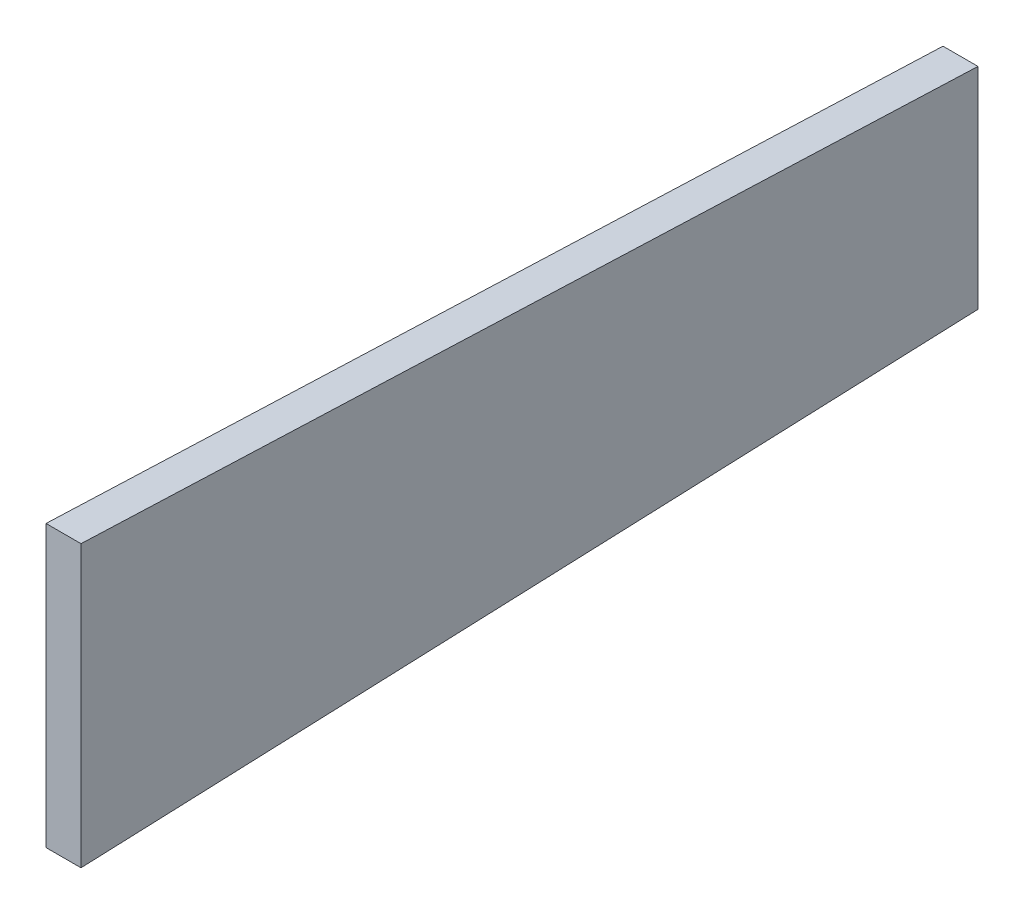
ISO-10303-21;
HEADER;
FILE_DESCRIPTION(('STEP AP214'),'2;1');
FILE_NAME('part.step','',(''),(''),'','','');
FILE_SCHEMA(('AUTOMOTIVE_DESIGN { 1 0 10303 214 1 1 1 1 }'));
ENDSEC;
DATA;
#1=APPLICATION_CONTEXT('core data for automotive mechanical design processes');
#2=APPLICATION_PROTOCOL_DEFINITION('international standard','automotive_design',2000,#1);
#3=PRODUCT_CONTEXT('',#1,'mechanical');
#4=PRODUCT('Part','Part','',(#3));
#5=PRODUCT_RELATED_PRODUCT_CATEGORY('part','',(#4));
#6=PRODUCT_DEFINITION_FORMATION('','',#4);
#7=PRODUCT_DEFINITION_CONTEXT('part definition',#1,'design');
#8=PRODUCT_DEFINITION('design','',#6,#7);
#9=PRODUCT_DEFINITION_SHAPE('','',#8);
#10=(LENGTH_UNIT() NAMED_UNIT(*) SI_UNIT(.MILLI.,.METRE.));
#11=(NAMED_UNIT(*) PLANE_ANGLE_UNIT() SI_UNIT($,.RADIAN.));
#12=(NAMED_UNIT(*) SI_UNIT($,.STERADIAN.) SOLID_ANGLE_UNIT());
#13=UNCERTAINTY_MEASURE_WITH_UNIT(LENGTH_MEASURE(1.E-05),#10,'distance_accuracy_value','');
#14=(GEOMETRIC_REPRESENTATION_CONTEXT(3) GLOBAL_UNCERTAINTY_ASSIGNED_CONTEXT((#13)) GLOBAL_UNIT_ASSIGNED_CONTEXT((#10,
#11,#12)) REPRESENTATION_CONTEXT('',''));
#15=CARTESIAN_POINT('',(0.,0.,0.));
#16=DIRECTION('',(0.,0.,1.));
#17=DIRECTION('',(1.,0.,0.));
#18=AXIS2_PLACEMENT_3D('',#15,#16,#17);
#19=CARTESIAN_POINT('',(4.,-16.0391459565648,90.));
#20=DIRECTION('',(0.,0.999231896166525,0.039186958078554));
#21=DIRECTION('',(0.,-0.0391869580785541,0.999231896166526));
#22=AXIS2_PLACEMENT_3D('',#19,#20,#21);
#23=PLANE('',#22);
#24=DIRECTION('',(0.,0.039186958078554,-0.999231896166525));
#25=VECTOR('',#24,1.);
#26=CARTESIAN_POINT('',(0.,-16.0391459565648,90.));
#27=LINE('',#26,#25);
#28=CARTESIAN_POINT('',(0.,-16.0391459565648,90.));
#29=VERTEX_POINT('',#28);
#30=CARTESIAN_POINT('',(0.,-12.0193951675223,-12.5));
#31=VERTEX_POINT('',#30);
#32=EDGE_CURVE('E96',#29,#31,#27,.T.);
#33=ORIENTED_EDGE('',*,*,#32,.T.);
#34=DIRECTION('',(-1.,0.,0.));
#35=VECTOR('',#34,1.);
#36=CARTESIAN_POINT('',(4.,-12.0193951675223,-12.5));
#37=LINE('',#36,#35);
#38=CARTESIAN_POINT('',(4.,-12.0193951675223,-12.5));
#39=VERTEX_POINT('',#38);
#40=EDGE_CURVE('E11',#39,#31,#37,.T.);
#41=ORIENTED_EDGE('',*,*,#40,.F.);
#42=DIRECTION('',(0.,0.039186958078554,-0.999231896166525));
#43=VECTOR('',#42,1.);
#44=CARTESIAN_POINT('',(4.,-16.0391459565648,90.));
#45=LINE('',#44,#43);
#46=CARTESIAN_POINT('',(4.,-16.0391459565648,90.));
#47=VERTEX_POINT('',#46);
#48=EDGE_CURVE('E84',#47,#39,#45,.T.);
#49=ORIENTED_EDGE('',*,*,#48,.F.);
#50=DIRECTION('',(-1.,0.,0.));
#51=VECTOR('',#50,1.);
#52=CARTESIAN_POINT('',(4.,-16.0391459565648,90.));
#53=LINE('',#52,#51);
#54=EDGE_CURVE('E92',#47,#29,#53,.T.);
#55=ORIENTED_EDGE('',*,*,#54,.T.);
#56=EDGE_LOOP('',(#33,#41,#49,#55));
#57=FACE_BOUND('',#56,.T.);
#58=ADVANCED_FACE('F33',(#57),#23,.F.);
#59=CARTESIAN_POINT('',(4.,-12.0193951675223,-12.5));
#60=DIRECTION('',(0.,0.,1.));
#61=DIRECTION('',(1.,0.,0.));
#62=AXIS2_PLACEMENT_3D('',#59,#60,#61);
#63=PLANE('',#62);
#64=DIRECTION('',(0.,1.,0.));
#65=VECTOR('',#64,1.);
#66=CARTESIAN_POINT('',(0.,-12.0193951675223,-12.5));
#67=LINE('',#66,#65);
#68=CARTESIAN_POINT('',(0.,12.0193951675223,-12.5));
#69=VERTEX_POINT('',#68);
#70=EDGE_CURVE('E88',#31,#69,#67,.T.);
#71=ORIENTED_EDGE('',*,*,#70,.T.);
#72=DIRECTION('',(-1.,0.,0.));
#73=VECTOR('',#72,1.);
#74=CARTESIAN_POINT('',(4.,12.0193951675223,-12.5));
#75=LINE('',#74,#73);
#76=CARTESIAN_POINT('',(4.,12.0193951675223,-12.5));
#77=VERTEX_POINT('',#76);
#78=EDGE_CURVE('E41',#77,#69,#75,.T.);
#79=ORIENTED_EDGE('',*,*,#78,.F.);
#80=DIRECTION('',(0.,1.,0.));
#81=VECTOR('',#80,1.);
#82=CARTESIAN_POINT('',(4.,-12.0193951675223,-12.5));
#83=LINE('',#82,#81);
#84=EDGE_CURVE('E79',#39,#77,#83,.T.);
#85=ORIENTED_EDGE('',*,*,#84,.F.);
#86=ORIENTED_EDGE('',*,*,#40,.T.);
#87=EDGE_LOOP('',(#71,#79,#85,#86));
#88=FACE_BOUND('',#87,.T.);
#89=ADVANCED_FACE('F87',(#88),#63,.F.);
#90=CARTESIAN_POINT('',(4.,16.0391459565646,90.));
#91=DIRECTION('',(0.,-0.999231896166526,0.0391869580785523));
#92=DIRECTION('',(0.,-0.0391869580785523,-0.999231896166526));
#93=AXIS2_PLACEMENT_3D('',#90,#91,#92);
#94=PLANE('',#93);
#95=DIRECTION('',(0.,0.0391869580785523,0.999231896166525));
#96=VECTOR('',#95,1.);
#97=CARTESIAN_POINT('',(0.,16.0391459565646,90.));
#98=LINE('',#97,#96);
#99=CARTESIAN_POINT('',(0.,16.0391459565646,90.));
#100=VERTEX_POINT('',#99);
#101=EDGE_CURVE('E66',#69,#100,#98,.T.);
#102=ORIENTED_EDGE('',*,*,#101,.T.);
#103=DIRECTION('',(-1.,0.,0.));
#104=VECTOR('',#103,1.);
#105=CARTESIAN_POINT('',(4.,16.0391459565646,90.));
#106=LINE('',#105,#104);
#107=CARTESIAN_POINT('',(4.,16.0391459565646,90.));
#108=VERTEX_POINT('',#107);
#109=EDGE_CURVE('E89',#108,#100,#106,.T.);
#110=ORIENTED_EDGE('',*,*,#109,.F.);
#111=DIRECTION('',(0.,0.0391869580785523,0.999231896166525));
#112=VECTOR('',#111,1.);
#113=CARTESIAN_POINT('',(4.,16.0391459565646,90.));
#114=LINE('',#113,#112);
#115=EDGE_CURVE('E82',#77,#108,#114,.T.);
#116=ORIENTED_EDGE('',*,*,#115,.F.);
#117=ORIENTED_EDGE('',*,*,#78,.T.);
#118=EDGE_LOOP('',(#102,#110,#116,#117));
#119=FACE_BOUND('',#118,.T.);
#120=ADVANCED_FACE('F90',(#119),#94,.F.);
#121=CARTESIAN_POINT('',(4.,16.0391459565646,90.));
#122=DIRECTION('',(0.,0.,-1.));
#123=DIRECTION('',(-1.,0.,0.));
#124=AXIS2_PLACEMENT_3D('',#121,#122,#123);
#125=PLANE('',#124);
#126=DIRECTION('',(0.,-1.,0.));
#127=VECTOR('',#126,1.);
#128=CARTESIAN_POINT('',(0.,16.0391459565646,90.));
#129=LINE('',#128,#127);
#130=EDGE_CURVE('E72',#100,#29,#129,.T.);
#131=ORIENTED_EDGE('',*,*,#130,.T.);
#132=ORIENTED_EDGE('',*,*,#54,.F.);
#133=DIRECTION('',(0.,-1.,0.));
#134=VECTOR('',#133,1.);
#135=CARTESIAN_POINT('',(4.,16.0391459565646,90.));
#136=LINE('',#135,#134);
#137=EDGE_CURVE('E49',#108,#47,#136,.T.);
#138=ORIENTED_EDGE('',*,*,#137,.F.);
#139=ORIENTED_EDGE('',*,*,#109,.T.);
#140=EDGE_LOOP('',(#131,#132,#138,#139));
#141=FACE_BOUND('',#140,.T.);
#142=ADVANCED_FACE('F103',(#141),#125,.F.);
#143=CARTESIAN_POINT('',(4.,0.,0.));
#144=DIRECTION('',(1.,0.,0.));
#145=DIRECTION('',(0.,0.,-1.));
#146=AXIS2_PLACEMENT_3D('',#143,#144,#145);
#147=PLANE('',#146);
#148=ORIENTED_EDGE('',*,*,#48,.T.);
#149=ORIENTED_EDGE('',*,*,#84,.T.);
#150=ORIENTED_EDGE('',*,*,#115,.T.);
#151=ORIENTED_EDGE('',*,*,#137,.T.);
#152=EDGE_LOOP('',(#148,#149,#150,#151));
#153=FACE_BOUND('',#152,.T.);
#154=ADVANCED_FACE('F80',(#153),#147,.T.);
#155=CARTESIAN_POINT('',(0.,0.,0.));
#156=DIRECTION('',(1.,0.,0.));
#157=DIRECTION('',(0.,0.,-1.));
#158=AXIS2_PLACEMENT_3D('',#155,#156,#157);
#159=PLANE('',#158);
#160=ORIENTED_EDGE('',*,*,#32,.F.);
#161=ORIENTED_EDGE('',*,*,#130,.F.);
#162=ORIENTED_EDGE('',*,*,#101,.F.);
#163=ORIENTED_EDGE('',*,*,#70,.F.);
#164=EDGE_LOOP('',(#160,#161,#162,#163));
#165=FACE_BOUND('',#164,.T.);
#166=ADVANCED_FACE('F106',(#165),#159,.F.);
#167=CLOSED_SHELL('',(#58,#89,#120,#142,#154,#166));
#168=MANIFOLD_SOLID_BREP('B2',#167);
#169=ADVANCED_BREP_SHAPE_REPRESENTATION('',(#18,#168),#14);
#170=SHAPE_DEFINITION_REPRESENTATION(#9,#169);
ENDSEC;
END-ISO-10303-21;
